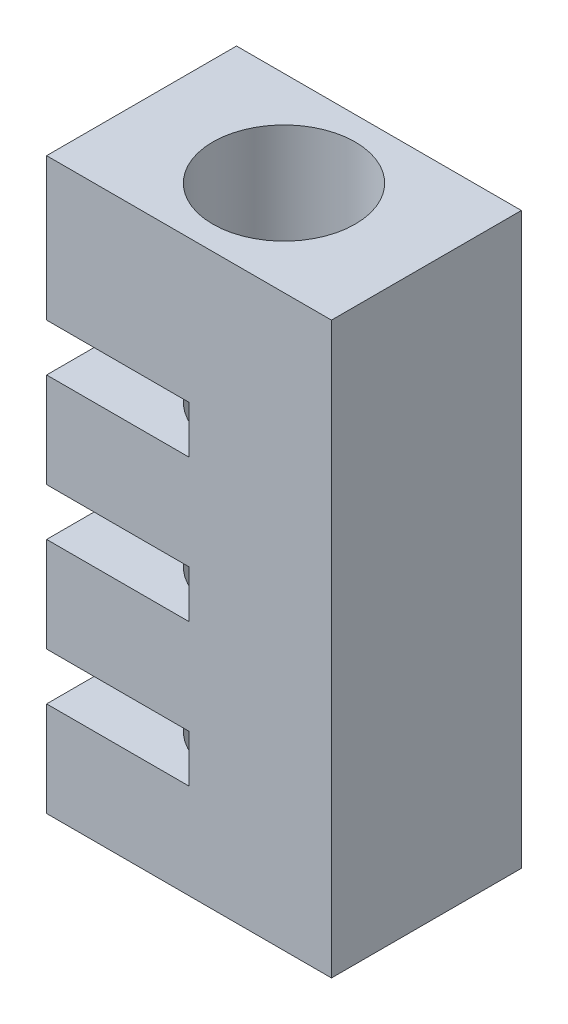
ISO-10303-21;
HEADER;
FILE_DESCRIPTION(('STEP AP214'),'2;1');
FILE_NAME('part.step','',(''),(''),'','','');
FILE_SCHEMA(('AUTOMOTIVE_DESIGN { 1 0 10303 214 1 1 1 1 }'));
ENDSEC;
DATA;
#1=APPLICATION_CONTEXT('core data for automotive mechanical design processes');
#2=APPLICATION_PROTOCOL_DEFINITION('international standard','automotive_design',2000,#1);
#3=PRODUCT_CONTEXT('',#1,'mechanical');
#4=PRODUCT('Part','Part','',(#3));
#5=PRODUCT_RELATED_PRODUCT_CATEGORY('part','',(#4));
#6=PRODUCT_DEFINITION_FORMATION('','',#4);
#7=PRODUCT_DEFINITION_CONTEXT('part definition',#1,'design');
#8=PRODUCT_DEFINITION('design','',#6,#7);
#9=PRODUCT_DEFINITION_SHAPE('','',#8);
#10=(LENGTH_UNIT() NAMED_UNIT(*) SI_UNIT(.MILLI.,.METRE.));
#11=(NAMED_UNIT(*) PLANE_ANGLE_UNIT() SI_UNIT($,.RADIAN.));
#12=(NAMED_UNIT(*) SI_UNIT($,.STERADIAN.) SOLID_ANGLE_UNIT());
#13=UNCERTAINTY_MEASURE_WITH_UNIT(LENGTH_MEASURE(1.E-05),#10,'distance_accuracy_value','');
#14=(GEOMETRIC_REPRESENTATION_CONTEXT(3) GLOBAL_UNCERTAINTY_ASSIGNED_CONTEXT((#13)) GLOBAL_UNIT_ASSIGNED_CONTEXT((#10,
#11,#12)) REPRESENTATION_CONTEXT('',''));
#15=CARTESIAN_POINT('',(0.,0.,0.));
#16=DIRECTION('',(0.,0.,1.));
#17=DIRECTION('',(1.,0.,0.));
#18=AXIS2_PLACEMENT_3D('',#15,#16,#17);
#19=CARTESIAN_POINT('',(15.,45.,20.));
#20=DIRECTION('',(1.,0.,0.));
#21=DIRECTION('',(0.,1.,0.));
#22=AXIS2_PLACEMENT_3D('',#19,#20,#21);
#23=PLANE('',#22);
#24=DIRECTION('',(0.,0.,-1.));
#25=VECTOR('',#24,1.);
#26=CARTESIAN_POINT('',(15.,40.,20.));
#27=LINE('',#26,#25);
#28=CARTESIAN_POINT('',(15.,40.,2.5));
#29=VERTEX_POINT('',#28);
#30=CARTESIAN_POINT('',(15.,40.,0.));
#31=VERTEX_POINT('',#30);
#32=EDGE_CURVE('E235',#29,#31,#27,.T.);
#33=ORIENTED_EDGE('',*,*,#32,.F.);
#34=DIRECTION('',(0.,1.,0.));
#35=VECTOR('',#34,1.);
#36=CARTESIAN_POINT('',(15.,0.,2.5));
#37=LINE('',#36,#35);
#38=CARTESIAN_POINT('',(15.,45.,2.5));
#39=VERTEX_POINT('',#38);
#40=EDGE_CURVE('E52',#29,#39,#37,.T.);
#41=ORIENTED_EDGE('',*,*,#40,.T.);
#42=DIRECTION('',(0.,0.,-1.));
#43=VECTOR('',#42,1.);
#44=CARTESIAN_POINT('',(15.,45.,20.));
#45=LINE('',#44,#43);
#46=CARTESIAN_POINT('',(15.,45.,0.));
#47=VERTEX_POINT('',#46);
#48=EDGE_CURVE('E239',#39,#47,#45,.T.);
#49=ORIENTED_EDGE('',*,*,#48,.T.);
#50=DIRECTION('',(0.,-1.,0.));
#51=VECTOR('',#50,1.);
#52=CARTESIAN_POINT('',(15.,45.,0.));
#53=LINE('',#52,#51);
#54=EDGE_CURVE('E287',#47,#31,#53,.T.);
#55=ORIENTED_EDGE('',*,*,#54,.T.);
#56=EDGE_LOOP('',(#33,#41,#49,#55));
#57=FACE_BOUND('',#56,.T.);
#58=ADVANCED_FACE('F37',(#57),#23,.F.);
#59=CARTESIAN_POINT('',(15.,30.,20.));
#60=DIRECTION('',(1.,0.,0.));
#61=DIRECTION('',(0.,0.,-1.));
#62=AXIS2_PLACEMENT_3D('',#59,#60,#61);
#63=PLANE('',#62);
#64=DIRECTION('',(0.,0.,-1.));
#65=VECTOR('',#64,1.);
#66=CARTESIAN_POINT('',(15.,25.,20.));
#67=LINE('',#66,#65);
#68=CARTESIAN_POINT('',(15.,25.,2.5));
#69=VERTEX_POINT('',#68);
#70=CARTESIAN_POINT('',(15.,25.,0.));
#71=VERTEX_POINT('',#70);
#72=EDGE_CURVE('E221',#69,#71,#67,.T.);
#73=ORIENTED_EDGE('',*,*,#72,.F.);
#74=DIRECTION('',(0.,1.,0.));
#75=VECTOR('',#74,1.);
#76=CARTESIAN_POINT('',(15.,0.,2.5));
#77=LINE('',#76,#75);
#78=CARTESIAN_POINT('',(15.,30.,2.5));
#79=VERTEX_POINT('',#78);
#80=EDGE_CURVE('E60',#69,#79,#77,.T.);
#81=ORIENTED_EDGE('',*,*,#80,.T.);
#82=DIRECTION('',(0.,0.,-1.));
#83=VECTOR('',#82,1.);
#84=CARTESIAN_POINT('',(15.,30.,20.));
#85=LINE('',#84,#83);
#86=CARTESIAN_POINT('',(15.,30.,0.));
#87=VERTEX_POINT('',#86);
#88=EDGE_CURVE('E225',#79,#87,#85,.T.);
#89=ORIENTED_EDGE('',*,*,#88,.T.);
#90=DIRECTION('',(0.,-1.,0.));
#91=VECTOR('',#90,1.);
#92=CARTESIAN_POINT('',(15.,30.,0.));
#93=LINE('',#92,#91);
#94=EDGE_CURVE('E297',#87,#71,#93,.T.);
#95=ORIENTED_EDGE('',*,*,#94,.T.);
#96=EDGE_LOOP('',(#73,#81,#89,#95));
#97=FACE_BOUND('',#96,.T.);
#98=ADVANCED_FACE('F352',(#97),#63,.F.);
#99=CARTESIAN_POINT('',(15.,15.,20.));
#100=DIRECTION('',(1.,0.,0.));
#101=DIRECTION('',(0.,1.,0.));
#102=AXIS2_PLACEMENT_3D('',#99,#100,#101);
#103=PLANE('',#102);
#104=DIRECTION('',(0.,0.,-1.));
#105=VECTOR('',#104,1.);
#106=CARTESIAN_POINT('',(15.,10.,20.));
#107=LINE('',#106,#105);
#108=CARTESIAN_POINT('',(15.,10.,2.5));
#109=VERTEX_POINT('',#108);
#110=CARTESIAN_POINT('',(15.,10.,0.));
#111=VERTEX_POINT('',#110);
#112=EDGE_CURVE('E208',#109,#111,#107,.T.);
#113=ORIENTED_EDGE('',*,*,#112,.F.);
#114=DIRECTION('',(0.,1.,0.));
#115=VECTOR('',#114,1.);
#116=CARTESIAN_POINT('',(15.,0.,2.5));
#117=LINE('',#116,#115);
#118=CARTESIAN_POINT('',(15.,15.,2.5));
#119=VERTEX_POINT('',#118);
#120=EDGE_CURVE('E189',#109,#119,#117,.T.);
#121=ORIENTED_EDGE('',*,*,#120,.T.);
#122=DIRECTION('',(0.,0.,-1.));
#123=VECTOR('',#122,1.);
#124=CARTESIAN_POINT('',(15.,15.,20.));
#125=LINE('',#124,#123);
#126=CARTESIAN_POINT('',(15.,15.,0.));
#127=VERTEX_POINT('',#126);
#128=EDGE_CURVE('E207',#119,#127,#125,.T.);
#129=ORIENTED_EDGE('',*,*,#128,.T.);
#130=DIRECTION('',(0.,-1.,0.));
#131=VECTOR('',#130,1.);
#132=CARTESIAN_POINT('',(15.,15.,0.));
#133=LINE('',#132,#131);
#134=EDGE_CURVE('E307',#127,#111,#133,.T.);
#135=ORIENTED_EDGE('',*,*,#134,.T.);
#136=EDGE_LOOP('',(#113,#121,#129,#135));
#137=FACE_BOUND('',#136,.T.);
#138=ADVANCED_FACE('F359',(#137),#103,.F.);
#139=CARTESIAN_POINT('',(0.,10.,20.));
#140=DIRECTION('',(1.,0.,0.));
#141=DIRECTION('',(0.,1.,0.));
#142=AXIS2_PLACEMENT_3D('',#139,#140,#141);
#143=PLANE('',#142);
#144=DIRECTION('',(0.,-1.,0.));
#145=VECTOR('',#144,1.);
#146=CARTESIAN_POINT('',(0.,10.,0.));
#147=LINE('',#146,#145);
#148=CARTESIAN_POINT('',(0.,10.,0.));
#149=VERTEX_POINT('',#148);
#150=CARTESIAN_POINT('',(0.,0.,0.));
#151=VERTEX_POINT('',#150);
#152=EDGE_CURVE('E267',#149,#151,#147,.T.);
#153=ORIENTED_EDGE('',*,*,#152,.T.);
#154=DIRECTION('',(0.,0.,-1.));
#155=VECTOR('',#154,1.);
#156=CARTESIAN_POINT('',(0.,0.,20.));
#157=LINE('',#156,#155);
#158=CARTESIAN_POINT('',(0.,0.,20.));
#159=VERTEX_POINT('',#158);
#160=EDGE_CURVE('E45',#159,#151,#157,.T.);
#161=ORIENTED_EDGE('',*,*,#160,.F.);
#162=DIRECTION('',(0.,-1.,0.));
#163=VECTOR('',#162,1.);
#164=CARTESIAN_POINT('',(0.,10.,20.));
#165=LINE('',#164,#163);
#166=CARTESIAN_POINT('',(0.,10.,20.));
#167=VERTEX_POINT('',#166);
#168=EDGE_CURVE('E310',#167,#159,#165,.T.);
#169=ORIENTED_EDGE('',*,*,#168,.F.);
#170=DIRECTION('',(0.,0.,-1.));
#171=VECTOR('',#170,1.);
#172=CARTESIAN_POINT('',(0.,10.,20.));
#173=LINE('',#172,#171);
#174=EDGE_CURVE('E211',#167,#149,#173,.T.);
#175=ORIENTED_EDGE('',*,*,#174,.T.);
#176=EDGE_LOOP('',(#153,#161,#169,#175));
#177=FACE_BOUND('',#176,.T.);
#178=ADVANCED_FACE('F39',(#177),#143,.F.);
#179=CARTESIAN_POINT('',(0.,0.,20.));
#180=DIRECTION('',(0.,1.,0.));
#181=DIRECTION('',(0.,0.,1.));
#182=AXIS2_PLACEMENT_3D('',#179,#180,#181);
#183=PLANE('',#182);
#184=CARTESIAN_POINT('',(15.,0.,10.));
#185=DIRECTION('',(0.,1.,0.));
#186=DIRECTION('',(0.,0.,1.));
#187=AXIS2_PLACEMENT_3D('',#184,#185,#186);
#188=CIRCLE('',#187,7.5);
#189=CARTESIAN_POINT('',(15.,0.,17.5));
#190=VERTEX_POINT('',#189);
#191=EDGE_CURVE('E202',#190,#190,#188,.T.);
#192=ORIENTED_EDGE('',*,*,#191,.T.);
#193=EDGE_LOOP('',(#192));
#194=FACE_BOUND('',#193,.T.);
#195=DIRECTION('',(1.,0.,0.));
#196=VECTOR('',#195,1.);
#197=CARTESIAN_POINT('',(0.,0.,0.));
#198=LINE('',#197,#196);
#199=CARTESIAN_POINT('',(30.,0.,0.));
#200=VERTEX_POINT('',#199);
#201=EDGE_CURVE('E260',#151,#200,#198,.T.);
#202=ORIENTED_EDGE('',*,*,#201,.T.);
#203=DIRECTION('',(0.,0.,-1.));
#204=VECTOR('',#203,1.);
#205=CARTESIAN_POINT('',(30.,0.,20.));
#206=LINE('',#205,#204);
#207=CARTESIAN_POINT('',(30.,0.,20.));
#208=VERTEX_POINT('',#207);
#209=EDGE_CURVE('E252',#208,#200,#206,.T.);
#210=ORIENTED_EDGE('',*,*,#209,.F.);
#211=DIRECTION('',(1.,0.,0.));
#212=VECTOR('',#211,1.);
#213=CARTESIAN_POINT('',(0.,0.,20.));
#214=LINE('',#213,#212);
#215=EDGE_CURVE('E261',#159,#208,#214,.T.);
#216=ORIENTED_EDGE('',*,*,#215,.F.);
#217=ORIENTED_EDGE('',*,*,#160,.T.);
#218=EDGE_LOOP('',(#202,#210,#216,#217));
#219=FACE_BOUND('',#218,.T.);
#220=ADVANCED_FACE('F258',(#194,#219),#183,.F.);
#221=CARTESIAN_POINT('',(30.,0.,20.));
#222=DIRECTION('',(-1.,0.,0.));
#223=DIRECTION('',(0.,0.,1.));
#224=AXIS2_PLACEMENT_3D('',#221,#222,#223);
#225=PLANE('',#224);
#226=DIRECTION('',(0.,1.,0.));
#227=VECTOR('',#226,1.);
#228=CARTESIAN_POINT('',(30.,0.,0.));
#229=LINE('',#228,#227);
#230=CARTESIAN_POINT('',(30.,60.,0.));
#231=VERTEX_POINT('',#230);
#232=EDGE_CURVE('E272',#200,#231,#229,.T.);
#233=ORIENTED_EDGE('',*,*,#232,.T.);
#234=DIRECTION('',(0.,0.,-1.));
#235=VECTOR('',#234,1.);
#236=CARTESIAN_POINT('',(30.,60.,20.));
#237=LINE('',#236,#235);
#238=CARTESIAN_POINT('',(30.,60.,20.));
#239=VERTEX_POINT('',#238);
#240=EDGE_CURVE('E249',#239,#231,#237,.T.);
#241=ORIENTED_EDGE('',*,*,#240,.F.);
#242=DIRECTION('',(0.,1.,0.));
#243=VECTOR('',#242,1.);
#244=CARTESIAN_POINT('',(30.,0.,20.));
#245=LINE('',#244,#243);
#246=EDGE_CURVE('E313',#208,#239,#245,.T.);
#247=ORIENTED_EDGE('',*,*,#246,.F.);
#248=ORIENTED_EDGE('',*,*,#209,.T.);
#249=EDGE_LOOP('',(#233,#241,#247,#248));
#250=FACE_BOUND('',#249,.T.);
#251=ADVANCED_FACE('F415',(#250),#225,.F.);
#252=CARTESIAN_POINT('',(30.,60.,20.));
#253=DIRECTION('',(0.,-1.,0.));
#254=DIRECTION('',(0.,0.,-1.));
#255=AXIS2_PLACEMENT_3D('',#252,#253,#254);
#256=PLANE('',#255);
#257=CARTESIAN_POINT('',(15.,60.,10.));
#258=DIRECTION('',(0.,1.,0.));
#259=DIRECTION('',(0.,0.,1.));
#260=AXIS2_PLACEMENT_3D('',#257,#258,#259);
#261=CIRCLE('',#260,7.5);
#262=CARTESIAN_POINT('',(15.,60.,17.5));
#263=VERTEX_POINT('',#262);
#264=EDGE_CURVE('E401',#263,#263,#261,.T.);
#265=ORIENTED_EDGE('',*,*,#264,.F.);
#266=EDGE_LOOP('',(#265));
#267=FACE_BOUND('',#266,.T.);
#268=DIRECTION('',(-1.,0.,0.));
#269=VECTOR('',#268,1.);
#270=CARTESIAN_POINT('',(30.,60.,0.));
#271=LINE('',#270,#269);
#272=CARTESIAN_POINT('',(0.,60.,0.));
#273=VERTEX_POINT('',#272);
#274=EDGE_CURVE('E280',#231,#273,#271,.T.);
#275=ORIENTED_EDGE('',*,*,#274,.T.);
#276=DIRECTION('',(0.,0.,-1.));
#277=VECTOR('',#276,1.);
#278=CARTESIAN_POINT('',(0.,60.,20.));
#279=LINE('',#278,#277);
#280=CARTESIAN_POINT('',(0.,60.,20.));
#281=VERTEX_POINT('',#280);
#282=EDGE_CURVE('E246',#281,#273,#279,.T.);
#283=ORIENTED_EDGE('',*,*,#282,.F.);
#284=DIRECTION('',(-1.,0.,0.));
#285=VECTOR('',#284,1.);
#286=CARTESIAN_POINT('',(30.,60.,20.));
#287=LINE('',#286,#285);
#288=EDGE_CURVE('E318',#239,#281,#287,.T.);
#289=ORIENTED_EDGE('',*,*,#288,.F.);
#290=ORIENTED_EDGE('',*,*,#240,.T.);
#291=EDGE_LOOP('',(#275,#283,#289,#290));
#292=FACE_BOUND('',#291,.T.);
#293=ADVANCED_FACE('F412',(#267,#292),#256,.F.);
#294=CARTESIAN_POINT('',(0.,60.,20.));
#295=DIRECTION('',(1.,0.,0.));
#296=DIRECTION('',(0.,1.,0.));
#297=AXIS2_PLACEMENT_3D('',#294,#295,#296);
#298=PLANE('',#297);
#299=DIRECTION('',(0.,-1.,0.));
#300=VECTOR('',#299,1.);
#301=CARTESIAN_POINT('',(0.,60.,0.));
#302=LINE('',#301,#300);
#303=CARTESIAN_POINT('',(0.,45.,0.));
#304=VERTEX_POINT('',#303);
#305=EDGE_CURVE('E282',#273,#304,#302,.T.);
#306=ORIENTED_EDGE('',*,*,#305,.T.);
#307=DIRECTION('',(0.,0.,-1.));
#308=VECTOR('',#307,1.);
#309=CARTESIAN_POINT('',(0.,45.,20.));
#310=LINE('',#309,#308);
#311=CARTESIAN_POINT('',(0.,45.,20.));
#312=VERTEX_POINT('',#311);
#313=EDGE_CURVE('E243',#312,#304,#310,.T.);
#314=ORIENTED_EDGE('',*,*,#313,.F.);
#315=DIRECTION('',(0.,-1.,0.));
#316=VECTOR('',#315,1.);
#317=CARTESIAN_POINT('',(0.,60.,20.));
#318=LINE('',#317,#316);
#319=EDGE_CURVE('E320',#281,#312,#318,.T.);
#320=ORIENTED_EDGE('',*,*,#319,.F.);
#321=ORIENTED_EDGE('',*,*,#282,.T.);
#322=EDGE_LOOP('',(#306,#314,#320,#321));
#323=FACE_BOUND('',#322,.T.);
#324=ADVANCED_FACE('F376',(#323),#298,.F.);
#325=CARTESIAN_POINT('',(0.,45.,20.));
#326=DIRECTION('',(0.,1.,0.));
#327=DIRECTION('',(0.,0.,1.));
#328=AXIS2_PLACEMENT_3D('',#325,#326,#327);
#329=PLANE('',#328);
#330=ORIENTED_EDGE('',*,*,#48,.F.);
#331=CARTESIAN_POINT('',(15.,45.,10.));
#332=DIRECTION('',(0.,1.,0.));
#333=DIRECTION('',(0.,0.,1.));
#334=AXIS2_PLACEMENT_3D('',#331,#332,#333);
#335=CIRCLE('',#334,7.5);
#336=CARTESIAN_POINT('',(15.,45.,17.5));
#337=VERTEX_POINT('',#336);
#338=EDGE_CURVE('E270',#39,#337,#335,.T.);
#339=ORIENTED_EDGE('',*,*,#338,.T.);
#340=CARTESIAN_POINT('',(15.,45.,20.));
#341=VERTEX_POINT('',#340);
#342=EDGE_CURVE('E240',#341,#337,#45,.T.);
#343=ORIENTED_EDGE('',*,*,#342,.F.);
#344=DIRECTION('',(1.,0.,0.));
#345=VECTOR('',#344,1.);
#346=CARTESIAN_POINT('',(0.,45.,20.));
#347=LINE('',#346,#345);
#348=EDGE_CURVE('E322',#312,#341,#347,.T.);
#349=ORIENTED_EDGE('',*,*,#348,.F.);
#350=ORIENTED_EDGE('',*,*,#313,.T.);
#351=DIRECTION('',(1.,0.,0.));
#352=VECTOR('',#351,1.);
#353=CARTESIAN_POINT('',(0.,45.,0.));
#354=LINE('',#353,#352);
#355=EDGE_CURVE('E284',#304,#47,#354,.T.);
#356=ORIENTED_EDGE('',*,*,#355,.T.);
#357=EDGE_LOOP('',(#330,#339,#343,#349,#350,#356));
#358=FACE_BOUND('',#357,.T.);
#359=ADVANCED_FACE('F368',(#358),#329,.F.);
#360=ORIENTED_EDGE('',*,*,#342,.T.);
#361=DIRECTION('',(0.,1.,0.));
#362=VECTOR('',#361,1.);
#363=CARTESIAN_POINT('',(15.,0.,17.5));
#364=LINE('',#363,#362);
#365=CARTESIAN_POINT('',(15.,40.,17.5));
#366=VERTEX_POINT('',#365);
#367=EDGE_CURVE('E382',#337,#366,#364,.F.);
#368=ORIENTED_EDGE('',*,*,#367,.T.);
#369=CARTESIAN_POINT('',(15.,40.,20.));
#370=VERTEX_POINT('',#369);
#371=EDGE_CURVE('E236',#370,#366,#27,.T.);
#372=ORIENTED_EDGE('',*,*,#371,.F.);
#373=DIRECTION('',(0.,-1.,0.));
#374=VECTOR('',#373,1.);
#375=CARTESIAN_POINT('',(15.,45.,20.));
#376=LINE('',#375,#374);
#377=EDGE_CURVE('E324',#341,#370,#376,.T.);
#378=ORIENTED_EDGE('',*,*,#377,.F.);
#379=EDGE_LOOP('',(#360,#368,#372,#378));
#380=FACE_BOUND('',#379,.T.);
#381=ADVANCED_FACE('F355',(#380),#23,.F.);
#382=CARTESIAN_POINT('',(15.,40.,20.));
#383=DIRECTION('',(0.,-1.,0.));
#384=DIRECTION('',(0.,0.,-1.));
#385=AXIS2_PLACEMENT_3D('',#382,#383,#384);
#386=PLANE('',#385);
#387=ORIENTED_EDGE('',*,*,#371,.T.);
#388=CARTESIAN_POINT('',(15.,40.,10.));
#389=DIRECTION('',(0.,-1.,0.));
#390=DIRECTION('',(0.,0.,-1.));
#391=AXIS2_PLACEMENT_3D('',#388,#389,#390);
#392=CIRCLE('',#391,7.5);
#393=EDGE_CURVE('E385',#366,#29,#392,.T.);
#394=ORIENTED_EDGE('',*,*,#393,.T.);
#395=ORIENTED_EDGE('',*,*,#32,.T.);
#396=DIRECTION('',(-1.,0.,0.));
#397=VECTOR('',#396,1.);
#398=CARTESIAN_POINT('',(15.,40.,0.));
#399=LINE('',#398,#397);
#400=CARTESIAN_POINT('',(0.,40.,0.));
#401=VERTEX_POINT('',#400);
#402=EDGE_CURVE('E290',#31,#401,#399,.T.);
#403=ORIENTED_EDGE('',*,*,#402,.T.);
#404=DIRECTION('',(0.,0.,-1.));
#405=VECTOR('',#404,1.);
#406=CARTESIAN_POINT('',(0.,40.,20.));
#407=LINE('',#406,#405);
#408=CARTESIAN_POINT('',(0.,40.,20.));
#409=VERTEX_POINT('',#408);
#410=EDGE_CURVE('E232',#409,#401,#407,.T.);
#411=ORIENTED_EDGE('',*,*,#410,.F.);
#412=DIRECTION('',(-1.,0.,0.));
#413=VECTOR('',#412,1.);
#414=CARTESIAN_POINT('',(15.,40.,20.));
#415=LINE('',#414,#413);
#416=EDGE_CURVE('E326',#370,#409,#415,.T.);
#417=ORIENTED_EDGE('',*,*,#416,.F.);
#418=EDGE_LOOP('',(#387,#394,#395,#403,#411,#417));
#419=FACE_BOUND('',#418,.T.);
#420=ADVANCED_FACE('F367',(#419),#386,.F.);
#421=CARTESIAN_POINT('',(0.,40.,20.));
#422=DIRECTION('',(1.,0.,0.));
#423=DIRECTION('',(0.,1.,0.));
#424=AXIS2_PLACEMENT_3D('',#421,#422,#423);
#425=PLANE('',#424);
#426=DIRECTION('',(0.,-1.,0.));
#427=VECTOR('',#426,1.);
#428=CARTESIAN_POINT('',(0.,40.,0.));
#429=LINE('',#428,#427);
#430=CARTESIAN_POINT('',(0.,30.,0.));
#431=VERTEX_POINT('',#430);
#432=EDGE_CURVE('E292',#401,#431,#429,.T.);
#433=ORIENTED_EDGE('',*,*,#432,.T.);
#434=DIRECTION('',(0.,0.,-1.));
#435=VECTOR('',#434,1.);
#436=CARTESIAN_POINT('',(0.,30.,20.));
#437=LINE('',#436,#435);
#438=CARTESIAN_POINT('',(0.,30.,20.));
#439=VERTEX_POINT('',#438);
#440=EDGE_CURVE('E229',#439,#431,#437,.T.);
#441=ORIENTED_EDGE('',*,*,#440,.F.);
#442=DIRECTION('',(0.,-1.,0.));
#443=VECTOR('',#442,1.);
#444=CARTESIAN_POINT('',(0.,40.,20.));
#445=LINE('',#444,#443);
#446=EDGE_CURVE('E328',#409,#439,#445,.T.);
#447=ORIENTED_EDGE('',*,*,#446,.F.);
#448=ORIENTED_EDGE('',*,*,#410,.T.);
#449=EDGE_LOOP('',(#433,#441,#447,#448));
#450=FACE_BOUND('',#449,.T.);
#451=ADVANCED_FACE('F374',(#450),#425,.F.);
#452=CARTESIAN_POINT('',(0.,30.,20.));
#453=DIRECTION('',(0.,1.,0.));
#454=DIRECTION('',(0.,0.,1.));
#455=AXIS2_PLACEMENT_3D('',#452,#453,#454);
#456=PLANE('',#455);
#457=ORIENTED_EDGE('',*,*,#88,.F.);
#458=CARTESIAN_POINT('',(15.,30.,10.));
#459=DIRECTION('',(0.,1.,0.));
#460=DIRECTION('',(0.,0.,1.));
#461=AXIS2_PLACEMENT_3D('',#458,#459,#460);
#462=CIRCLE('',#461,7.5);
#463=CARTESIAN_POINT('',(15.,30.,17.5));
#464=VERTEX_POINT('',#463);
#465=EDGE_CURVE('E389',#79,#464,#462,.T.);
#466=ORIENTED_EDGE('',*,*,#465,.T.);
#467=CARTESIAN_POINT('',(15.,30.,20.));
#468=VERTEX_POINT('',#467);
#469=EDGE_CURVE('E226',#468,#464,#85,.T.);
#470=ORIENTED_EDGE('',*,*,#469,.F.);
#471=DIRECTION('',(1.,0.,0.));
#472=VECTOR('',#471,1.);
#473=CARTESIAN_POINT('',(0.,30.,20.));
#474=LINE('',#473,#472);
#475=EDGE_CURVE('E330',#439,#468,#474,.T.);
#476=ORIENTED_EDGE('',*,*,#475,.F.);
#477=ORIENTED_EDGE('',*,*,#440,.T.);
#478=DIRECTION('',(1.,0.,0.));
#479=VECTOR('',#478,1.);
#480=CARTESIAN_POINT('',(0.,30.,0.));
#481=LINE('',#480,#479);
#482=EDGE_CURVE('E294',#431,#87,#481,.T.);
#483=ORIENTED_EDGE('',*,*,#482,.T.);
#484=EDGE_LOOP('',(#457,#466,#470,#476,#477,#483));
#485=FACE_BOUND('',#484,.T.);
#486=ADVANCED_FACE('F476',(#485),#456,.F.);
#487=ORIENTED_EDGE('',*,*,#469,.T.);
#488=DIRECTION('',(0.,1.,0.));
#489=VECTOR('',#488,1.);
#490=CARTESIAN_POINT('',(15.,0.,17.5));
#491=LINE('',#490,#489);
#492=CARTESIAN_POINT('',(15.,25.,17.5));
#493=VERTEX_POINT('',#492);
#494=EDGE_CURVE('E393',#464,#493,#491,.F.);
#495=ORIENTED_EDGE('',*,*,#494,.T.);
#496=CARTESIAN_POINT('',(15.,25.,20.));
#497=VERTEX_POINT('',#496);
#498=EDGE_CURVE('E222',#497,#493,#67,.T.);
#499=ORIENTED_EDGE('',*,*,#498,.F.);
#500=DIRECTION('',(0.,-1.,0.));
#501=VECTOR('',#500,1.);
#502=CARTESIAN_POINT('',(15.,30.,20.));
#503=LINE('',#502,#501);
#504=EDGE_CURVE('E332',#468,#497,#503,.T.);
#505=ORIENTED_EDGE('',*,*,#504,.F.);
#506=EDGE_LOOP('',(#487,#495,#499,#505));
#507=FACE_BOUND('',#506,.T.);
#508=ADVANCED_FACE('F362',(#507),#63,.F.);
#509=CARTESIAN_POINT('',(15.,25.,20.));
#510=DIRECTION('',(0.,-1.,0.));
#511=DIRECTION('',(1.,0.,0.));
#512=AXIS2_PLACEMENT_3D('',#509,#510,#511);
#513=PLANE('',#512);
#514=ORIENTED_EDGE('',*,*,#498,.T.);
#515=CARTESIAN_POINT('',(15.,25.,10.));
#516=DIRECTION('',(0.,-1.,0.));
#517=DIRECTION('',(1.,0.,0.));
#518=AXIS2_PLACEMENT_3D('',#515,#516,#517);
#519=CIRCLE('',#518,7.5);
#520=EDGE_CURVE('E396',#493,#69,#519,.T.);
#521=ORIENTED_EDGE('',*,*,#520,.T.);
#522=ORIENTED_EDGE('',*,*,#72,.T.);
#523=DIRECTION('',(-1.,0.,0.));
#524=VECTOR('',#523,1.);
#525=CARTESIAN_POINT('',(15.,25.,0.));
#526=LINE('',#525,#524);
#527=CARTESIAN_POINT('',(0.,25.,0.));
#528=VERTEX_POINT('',#527);
#529=EDGE_CURVE('E300',#71,#528,#526,.T.);
#530=ORIENTED_EDGE('',*,*,#529,.T.);
#531=DIRECTION('',(0.,0.,-1.));
#532=VECTOR('',#531,1.);
#533=CARTESIAN_POINT('',(0.,25.,20.));
#534=LINE('',#533,#532);
#535=CARTESIAN_POINT('',(0.,25.,20.));
#536=VERTEX_POINT('',#535);
#537=EDGE_CURVE('E218',#536,#528,#534,.T.);
#538=ORIENTED_EDGE('',*,*,#537,.F.);
#539=DIRECTION('',(-1.,0.,0.));
#540=VECTOR('',#539,1.);
#541=CARTESIAN_POINT('',(15.,25.,20.));
#542=LINE('',#541,#540);
#543=EDGE_CURVE('E334',#497,#536,#542,.T.);
#544=ORIENTED_EDGE('',*,*,#543,.F.);
#545=EDGE_LOOP('',(#514,#521,#522,#530,#538,#544));
#546=FACE_BOUND('',#545,.T.);
#547=ADVANCED_FACE('F490',(#546),#513,.F.);
#548=CARTESIAN_POINT('',(0.,25.,20.));
#549=DIRECTION('',(1.,0.,0.));
#550=DIRECTION('',(0.,1.,0.));
#551=AXIS2_PLACEMENT_3D('',#548,#549,#550);
#552=PLANE('',#551);
#553=DIRECTION('',(0.,-1.,0.));
#554=VECTOR('',#553,1.);
#555=CARTESIAN_POINT('',(0.,25.,0.));
#556=LINE('',#555,#554);
#557=CARTESIAN_POINT('',(0.,15.,0.));
#558=VERTEX_POINT('',#557);
#559=EDGE_CURVE('E302',#528,#558,#556,.T.);
#560=ORIENTED_EDGE('',*,*,#559,.T.);
#561=DIRECTION('',(0.,0.,-1.));
#562=VECTOR('',#561,1.);
#563=CARTESIAN_POINT('',(0.,15.,20.));
#564=LINE('',#563,#562);
#565=CARTESIAN_POINT('',(0.,15.,20.));
#566=VERTEX_POINT('',#565);
#567=EDGE_CURVE('E215',#566,#558,#564,.T.);
#568=ORIENTED_EDGE('',*,*,#567,.F.);
#569=DIRECTION('',(0.,-1.,0.));
#570=VECTOR('',#569,1.);
#571=CARTESIAN_POINT('',(0.,25.,20.));
#572=LINE('',#571,#570);
#573=EDGE_CURVE('E336',#536,#566,#572,.T.);
#574=ORIENTED_EDGE('',*,*,#573,.F.);
#575=ORIENTED_EDGE('',*,*,#537,.T.);
#576=EDGE_LOOP('',(#560,#568,#574,#575));
#577=FACE_BOUND('',#576,.T.);
#578=ADVANCED_FACE('F499',(#577),#552,.F.);
#579=CARTESIAN_POINT('',(0.,15.,20.));
#580=DIRECTION('',(0.,1.,0.));
#581=DIRECTION('',(0.,0.,1.));
#582=AXIS2_PLACEMENT_3D('',#579,#580,#581);
#583=PLANE('',#582);
#584=ORIENTED_EDGE('',*,*,#128,.F.);
#585=CARTESIAN_POINT('',(15.,15.,10.));
#586=DIRECTION('',(0.,1.,0.));
#587=DIRECTION('',(0.,0.,1.));
#588=AXIS2_PLACEMENT_3D('',#585,#586,#587);
#589=CIRCLE('',#588,7.5);
#590=CARTESIAN_POINT('',(15.,15.,17.5));
#591=VERTEX_POINT('',#590);
#592=EDGE_CURVE('E398',#119,#591,#589,.T.);
#593=ORIENTED_EDGE('',*,*,#592,.T.);
#594=CARTESIAN_POINT('',(15.,15.,20.));
#595=VERTEX_POINT('',#594);
#596=EDGE_CURVE('E201',#595,#591,#125,.T.);
#597=ORIENTED_EDGE('',*,*,#596,.F.);
#598=DIRECTION('',(1.,0.,0.));
#599=VECTOR('',#598,1.);
#600=CARTESIAN_POINT('',(0.,15.,20.));
#601=LINE('',#600,#599);
#602=EDGE_CURVE('E338',#566,#595,#601,.T.);
#603=ORIENTED_EDGE('',*,*,#602,.F.);
#604=ORIENTED_EDGE('',*,*,#567,.T.);
#605=DIRECTION('',(1.,0.,0.));
#606=VECTOR('',#605,1.);
#607=CARTESIAN_POINT('',(0.,15.,0.));
#608=LINE('',#607,#606);
#609=EDGE_CURVE('E304',#558,#127,#608,.T.);
#610=ORIENTED_EDGE('',*,*,#609,.T.);
#611=EDGE_LOOP('',(#584,#593,#597,#603,#604,#610));
#612=FACE_BOUND('',#611,.T.);
#613=ADVANCED_FACE('F507',(#612),#583,.F.);
#614=ORIENTED_EDGE('',*,*,#596,.T.);
#615=DIRECTION('',(0.,1.,0.));
#616=VECTOR('',#615,1.);
#617=CARTESIAN_POINT('',(15.,0.,17.5));
#618=LINE('',#617,#616);
#619=CARTESIAN_POINT('',(15.,10.,17.5));
#620=VERTEX_POINT('',#619);
#621=EDGE_CURVE('E186',#591,#620,#618,.F.);
#622=ORIENTED_EDGE('',*,*,#621,.T.);
#623=CARTESIAN_POINT('',(15.,10.,20.));
#624=VERTEX_POINT('',#623);
#625=EDGE_CURVE('E198',#624,#620,#107,.T.);
#626=ORIENTED_EDGE('',*,*,#625,.F.);
#627=DIRECTION('',(0.,-1.,0.));
#628=VECTOR('',#627,1.);
#629=CARTESIAN_POINT('',(15.,15.,20.));
#630=LINE('',#629,#628);
#631=EDGE_CURVE('E339',#595,#624,#630,.T.);
#632=ORIENTED_EDGE('',*,*,#631,.F.);
#633=EDGE_LOOP('',(#614,#622,#626,#632));
#634=FACE_BOUND('',#633,.T.);
#635=ADVANCED_FACE('F196',(#634),#103,.F.);
#636=CARTESIAN_POINT('',(15.,10.,20.));
#637=DIRECTION('',(0.,-1.,0.));
#638=DIRECTION('',(1.,0.,0.));
#639=AXIS2_PLACEMENT_3D('',#636,#637,#638);
#640=PLANE('',#639);
#641=ORIENTED_EDGE('',*,*,#625,.T.);
#642=CARTESIAN_POINT('',(15.,10.,10.));
#643=DIRECTION('',(0.,-1.,0.));
#644=DIRECTION('',(1.,0.,0.));
#645=AXIS2_PLACEMENT_3D('',#642,#643,#644);
#646=CIRCLE('',#645,7.5);
#647=EDGE_CURVE('E11',#620,#109,#646,.T.);
#648=ORIENTED_EDGE('',*,*,#647,.T.);
#649=ORIENTED_EDGE('',*,*,#112,.T.);
#650=DIRECTION('',(-1.,0.,0.));
#651=VECTOR('',#650,1.);
#652=CARTESIAN_POINT('',(15.,10.,0.));
#653=LINE('',#652,#651);
#654=EDGE_CURVE('E309',#111,#149,#653,.T.);
#655=ORIENTED_EDGE('',*,*,#654,.T.);
#656=ORIENTED_EDGE('',*,*,#174,.F.);
#657=DIRECTION('',(-1.,0.,0.));
#658=VECTOR('',#657,1.);
#659=CARTESIAN_POINT('',(15.,10.,20.));
#660=LINE('',#659,#658);
#661=EDGE_CURVE('E206',#624,#167,#660,.T.);
#662=ORIENTED_EDGE('',*,*,#661,.F.);
#663=EDGE_LOOP('',(#641,#648,#649,#655,#656,#662));
#664=FACE_BOUND('',#663,.T.);
#665=ADVANCED_FACE('F204',(#664),#640,.F.);
#666=CARTESIAN_POINT('',(0.,0.,20.));
#667=DIRECTION('',(0.,0.,1.));
#668=DIRECTION('',(1.,0.,0.));
#669=AXIS2_PLACEMENT_3D('',#666,#667,#668);
#670=PLANE('',#669);
#671=ORIENTED_EDGE('',*,*,#168,.T.);
#672=ORIENTED_EDGE('',*,*,#215,.T.);
#673=ORIENTED_EDGE('',*,*,#246,.T.);
#674=ORIENTED_EDGE('',*,*,#288,.T.);
#675=ORIENTED_EDGE('',*,*,#319,.T.);
#676=ORIENTED_EDGE('',*,*,#348,.T.);
#677=ORIENTED_EDGE('',*,*,#377,.T.);
#678=ORIENTED_EDGE('',*,*,#416,.T.);
#679=ORIENTED_EDGE('',*,*,#446,.T.);
#680=ORIENTED_EDGE('',*,*,#475,.T.);
#681=ORIENTED_EDGE('',*,*,#504,.T.);
#682=ORIENTED_EDGE('',*,*,#543,.T.);
#683=ORIENTED_EDGE('',*,*,#573,.T.);
#684=ORIENTED_EDGE('',*,*,#602,.T.);
#685=ORIENTED_EDGE('',*,*,#631,.T.);
#686=ORIENTED_EDGE('',*,*,#661,.T.);
#687=EDGE_LOOP('',(#671,#672,#673,#674,#675,#676,#677,#678,#679,#680,#681,#682,#683,#684,#685,#686));
#688=FACE_BOUND('',#687,.T.);
#689=ADVANCED_FACE('F340',(#688),#670,.T.);
#690=CARTESIAN_POINT('',(0.,0.,0.));
#691=DIRECTION('',(0.,0.,1.));
#692=DIRECTION('',(1.,0.,0.));
#693=AXIS2_PLACEMENT_3D('',#690,#691,#692);
#694=PLANE('',#693);
#695=ORIENTED_EDGE('',*,*,#152,.F.);
#696=ORIENTED_EDGE('',*,*,#654,.F.);
#697=ORIENTED_EDGE('',*,*,#134,.F.);
#698=ORIENTED_EDGE('',*,*,#609,.F.);
#699=ORIENTED_EDGE('',*,*,#559,.F.);
#700=ORIENTED_EDGE('',*,*,#529,.F.);
#701=ORIENTED_EDGE('',*,*,#94,.F.);
#702=ORIENTED_EDGE('',*,*,#482,.F.);
#703=ORIENTED_EDGE('',*,*,#432,.F.);
#704=ORIENTED_EDGE('',*,*,#402,.F.);
#705=ORIENTED_EDGE('',*,*,#54,.F.);
#706=ORIENTED_EDGE('',*,*,#355,.F.);
#707=ORIENTED_EDGE('',*,*,#305,.F.);
#708=ORIENTED_EDGE('',*,*,#274,.F.);
#709=ORIENTED_EDGE('',*,*,#232,.F.);
#710=ORIENTED_EDGE('',*,*,#201,.F.);
#711=EDGE_LOOP('',(#695,#696,#697,#698,#699,#700,#701,#702,#703,#704,#705,#706,#707,#708,#709,#710));
#712=FACE_BOUND('',#711,.T.);
#713=ADVANCED_FACE('F342',(#712),#694,.F.);
#714=CARTESIAN_POINT('',(15.,0.,10.));
#715=DIRECTION('',(0.,1.,0.));
#716=DIRECTION('',(0.,0.,1.));
#717=AXIS2_PLACEMENT_3D('',#714,#715,#716);
#718=CYLINDRICAL_SURFACE('',#717,7.5);
#719=ORIENTED_EDGE('',*,*,#191,.F.);
#720=EDGE_LOOP('',(#719));
#721=FACE_BOUND('',#720,.T.);
#722=ORIENTED_EDGE('',*,*,#264,.T.);
#723=EDGE_LOOP('',(#722));
#724=FACE_BOUND('',#723,.T.);
#725=ORIENTED_EDGE('',*,*,#120,.F.);
#726=ORIENTED_EDGE('',*,*,#647,.F.);
#727=ORIENTED_EDGE('',*,*,#621,.F.);
#728=ORIENTED_EDGE('',*,*,#592,.F.);
#729=EDGE_LOOP('',(#725,#726,#727,#728));
#730=FACE_BOUND('',#729,.T.);
#731=ORIENTED_EDGE('',*,*,#80,.F.);
#732=ORIENTED_EDGE('',*,*,#520,.F.);
#733=ORIENTED_EDGE('',*,*,#494,.F.);
#734=ORIENTED_EDGE('',*,*,#465,.F.);
#735=EDGE_LOOP('',(#731,#732,#733,#734));
#736=FACE_BOUND('',#735,.T.);
#737=ORIENTED_EDGE('',*,*,#40,.F.);
#738=ORIENTED_EDGE('',*,*,#393,.F.);
#739=ORIENTED_EDGE('',*,*,#367,.F.);
#740=ORIENTED_EDGE('',*,*,#338,.F.);
#741=EDGE_LOOP('',(#737,#738,#739,#740));
#742=FACE_BOUND('',#741,.T.);
#743=ADVANCED_FACE('F185',(#721,#724,#730,#736,#742),#718,.F.);
#744=CLOSED_SHELL('',(#58,#98,#138,#178,#220,#251,#293,#324,#359,#381,#420,#451,#486,#508,#547,
#578,#613,#635,#665,#689,#713,#743));
#745=MANIFOLD_SOLID_BREP('B2',#744);
#746=ADVANCED_BREP_SHAPE_REPRESENTATION('',(#18,#745),#14);
#747=SHAPE_DEFINITION_REPRESENTATION(#9,#746);
ENDSEC;
END-ISO-10303-21;
